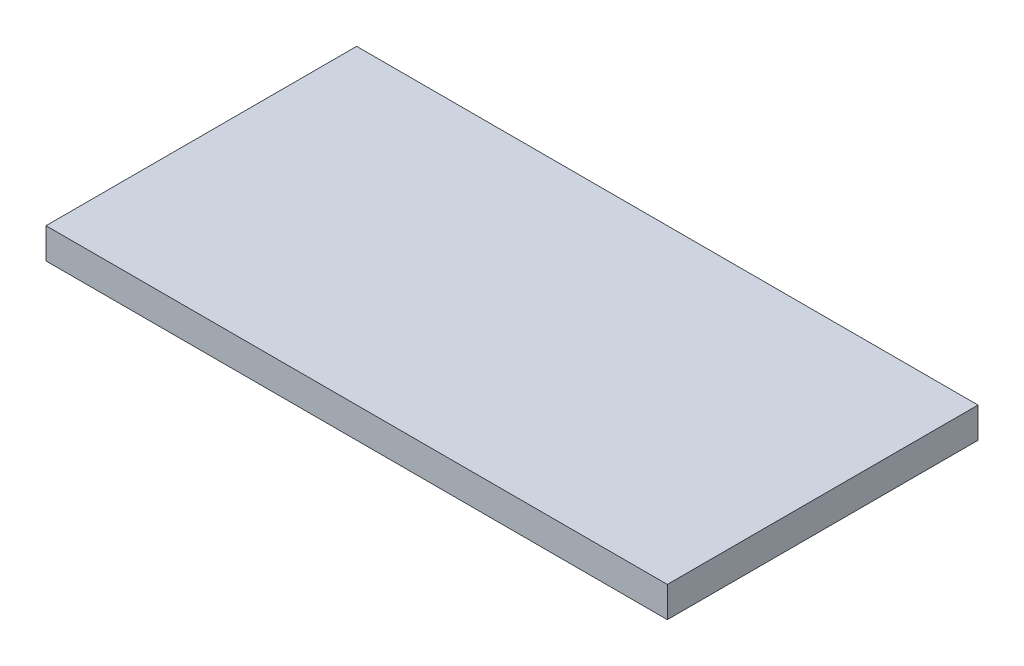
ISO-10303-21;
HEADER;
FILE_DESCRIPTION(('STEP AP214'),'2;1');
FILE_NAME('part.step','',(''),(''),'','','');
FILE_SCHEMA(('AUTOMOTIVE_DESIGN { 1 0 10303 214 1 1 1 1 }'));
ENDSEC;
DATA;
#1=APPLICATION_CONTEXT('core data for automotive mechanical design processes');
#2=APPLICATION_PROTOCOL_DEFINITION('international standard','automotive_design',2000,#1);
#3=PRODUCT_CONTEXT('',#1,'mechanical');
#4=PRODUCT('Part','Part','',(#3));
#5=PRODUCT_RELATED_PRODUCT_CATEGORY('part','',(#4));
#6=PRODUCT_DEFINITION_FORMATION('','',#4);
#7=PRODUCT_DEFINITION_CONTEXT('part definition',#1,'design');
#8=PRODUCT_DEFINITION('design','',#6,#7);
#9=PRODUCT_DEFINITION_SHAPE('','',#8);
#10=(LENGTH_UNIT() NAMED_UNIT(*) SI_UNIT(.MILLI.,.METRE.));
#11=(NAMED_UNIT(*) PLANE_ANGLE_UNIT() SI_UNIT($,.RADIAN.));
#12=(NAMED_UNIT(*) SI_UNIT($,.STERADIAN.) SOLID_ANGLE_UNIT());
#13=UNCERTAINTY_MEASURE_WITH_UNIT(LENGTH_MEASURE(1.E-05),#10,'distance_accuracy_value','');
#14=(GEOMETRIC_REPRESENTATION_CONTEXT(3) GLOBAL_UNCERTAINTY_ASSIGNED_CONTEXT((#13)) GLOBAL_UNIT_ASSIGNED_CONTEXT((#10,
#11,#12)) REPRESENTATION_CONTEXT('',''));
#15=CARTESIAN_POINT('',(0.,0.,0.));
#16=DIRECTION('',(0.,0.,1.));
#17=DIRECTION('',(1.,0.,0.));
#18=AXIS2_PLACEMENT_3D('',#15,#16,#17);
#19=CARTESIAN_POINT('',(-609.6,59.944,-304.8));
#20=DIRECTION('',(1.,0.,0.));
#21=DIRECTION('',(0.,0.,-1.));
#22=AXIS2_PLACEMENT_3D('',#19,#20,#21);
#23=PLANE('',#22);
#24=DIRECTION('',(0.,0.,1.));
#25=VECTOR('',#24,1.);
#26=CARTESIAN_POINT('',(-609.6,0.,-304.8));
#27=LINE('',#26,#25);
#28=CARTESIAN_POINT('',(-609.6,0.,-304.8));
#29=VERTEX_POINT('',#28);
#30=CARTESIAN_POINT('',(-609.6,0.,304.8));
#31=VERTEX_POINT('',#30);
#32=EDGE_CURVE('E94',#29,#31,#27,.T.);
#33=ORIENTED_EDGE('',*,*,#32,.T.);
#34=DIRECTION('',(0.,-1.,0.));
#35=VECTOR('',#34,1.);
#36=CARTESIAN_POINT('',(-609.6,59.944,304.8));
#37=LINE('',#36,#35);
#38=CARTESIAN_POINT('',(-609.6,59.944,304.8));
#39=VERTEX_POINT('',#38);
#40=EDGE_CURVE('E11',#39,#31,#37,.T.);
#41=ORIENTED_EDGE('',*,*,#40,.F.);
#42=DIRECTION('',(0.,0.,1.));
#43=VECTOR('',#42,1.);
#44=CARTESIAN_POINT('',(-609.6,59.944,-304.8));
#45=LINE('',#44,#43);
#46=CARTESIAN_POINT('',(-609.6,59.944,-304.8));
#47=VERTEX_POINT('',#46);
#48=EDGE_CURVE('E82',#47,#39,#45,.T.);
#49=ORIENTED_EDGE('',*,*,#48,.F.);
#50=DIRECTION('',(0.,-1.,0.));
#51=VECTOR('',#50,1.);
#52=CARTESIAN_POINT('',(-609.6,59.944,-304.8));
#53=LINE('',#52,#51);
#54=EDGE_CURVE('E90',#47,#29,#53,.T.);
#55=ORIENTED_EDGE('',*,*,#54,.T.);
#56=EDGE_LOOP('',(#33,#41,#49,#55));
#57=FACE_BOUND('',#56,.T.);
#58=ADVANCED_FACE('F31',(#57),#23,.F.);
#59=CARTESIAN_POINT('',(-609.6,59.944,304.8));
#60=DIRECTION('',(0.,0.,-1.));
#61=DIRECTION('',(-1.,0.,0.));
#62=AXIS2_PLACEMENT_3D('',#59,#60,#61);
#63=PLANE('',#62);
#64=DIRECTION('',(1.,0.,0.));
#65=VECTOR('',#64,1.);
#66=CARTESIAN_POINT('',(-609.6,0.,304.8));
#67=LINE('',#66,#65);
#68=CARTESIAN_POINT('',(609.6,0.,304.8));
#69=VERTEX_POINT('',#68);
#70=EDGE_CURVE('E86',#31,#69,#67,.T.);
#71=ORIENTED_EDGE('',*,*,#70,.T.);
#72=DIRECTION('',(0.,-1.,0.));
#73=VECTOR('',#72,1.);
#74=CARTESIAN_POINT('',(609.6,59.944,304.8));
#75=LINE('',#74,#73);
#76=CARTESIAN_POINT('',(609.6,59.944,304.8));
#77=VERTEX_POINT('',#76);
#78=EDGE_CURVE('E39',#77,#69,#75,.T.);
#79=ORIENTED_EDGE('',*,*,#78,.F.);
#80=DIRECTION('',(1.,0.,0.));
#81=VECTOR('',#80,1.);
#82=CARTESIAN_POINT('',(-609.6,59.944,304.8));
#83=LINE('',#82,#81);
#84=EDGE_CURVE('E77',#39,#77,#83,.T.);
#85=ORIENTED_EDGE('',*,*,#84,.F.);
#86=ORIENTED_EDGE('',*,*,#40,.T.);
#87=EDGE_LOOP('',(#71,#79,#85,#86));
#88=FACE_BOUND('',#87,.T.);
#89=ADVANCED_FACE('F85',(#88),#63,.F.);
#90=CARTESIAN_POINT('',(609.6,59.944,-304.8));
#91=DIRECTION('',(-1.,0.,0.));
#92=DIRECTION('',(0.,0.,1.));
#93=AXIS2_PLACEMENT_3D('',#90,#91,#92);
#94=PLANE('',#93);
#95=DIRECTION('',(0.,0.,-1.));
#96=VECTOR('',#95,1.);
#97=CARTESIAN_POINT('',(609.6,0.,-304.8));
#98=LINE('',#97,#96);
#99=CARTESIAN_POINT('',(609.6,0.,-304.8));
#100=VERTEX_POINT('',#99);
#101=EDGE_CURVE('E64',#69,#100,#98,.T.);
#102=ORIENTED_EDGE('',*,*,#101,.T.);
#103=DIRECTION('',(0.,-1.,0.));
#104=VECTOR('',#103,1.);
#105=CARTESIAN_POINT('',(609.6,59.944,-304.8));
#106=LINE('',#105,#104);
#107=CARTESIAN_POINT('',(609.6,59.944,-304.8));
#108=VERTEX_POINT('',#107);
#109=EDGE_CURVE('E87',#108,#100,#106,.T.);
#110=ORIENTED_EDGE('',*,*,#109,.F.);
#111=DIRECTION('',(0.,0.,-1.));
#112=VECTOR('',#111,1.);
#113=CARTESIAN_POINT('',(609.6,59.944,-304.8));
#114=LINE('',#113,#112);
#115=EDGE_CURVE('E80',#77,#108,#114,.T.);
#116=ORIENTED_EDGE('',*,*,#115,.F.);
#117=ORIENTED_EDGE('',*,*,#78,.T.);
#118=EDGE_LOOP('',(#102,#110,#116,#117));
#119=FACE_BOUND('',#118,.T.);
#120=ADVANCED_FACE('F88',(#119),#94,.F.);
#121=CARTESIAN_POINT('',(-609.6,59.944,-304.8));
#122=DIRECTION('',(0.,0.,1.));
#123=DIRECTION('',(1.,0.,0.));
#124=AXIS2_PLACEMENT_3D('',#121,#122,#123);
#125=PLANE('',#124);
#126=DIRECTION('',(-1.,0.,0.));
#127=VECTOR('',#126,1.);
#128=CARTESIAN_POINT('',(-609.6,0.,-304.8));
#129=LINE('',#128,#127);
#130=EDGE_CURVE('E70',#100,#29,#129,.T.);
#131=ORIENTED_EDGE('',*,*,#130,.T.);
#132=ORIENTED_EDGE('',*,*,#54,.F.);
#133=DIRECTION('',(-1.,0.,0.));
#134=VECTOR('',#133,1.);
#135=CARTESIAN_POINT('',(-609.6,59.944,-304.8));
#136=LINE('',#135,#134);
#137=EDGE_CURVE('E47',#108,#47,#136,.T.);
#138=ORIENTED_EDGE('',*,*,#137,.F.);
#139=ORIENTED_EDGE('',*,*,#109,.T.);
#140=EDGE_LOOP('',(#131,#132,#138,#139));
#141=FACE_BOUND('',#140,.T.);
#142=ADVANCED_FACE('F101',(#141),#125,.F.);
#143=CARTESIAN_POINT('',(-609.6,59.944,304.8));
#144=DIRECTION('',(0.,1.,0.));
#145=DIRECTION('',(0.,0.,1.));
#146=AXIS2_PLACEMENT_3D('',#143,#144,#145);
#147=PLANE('',#146);
#148=ORIENTED_EDGE('',*,*,#48,.T.);
#149=ORIENTED_EDGE('',*,*,#84,.T.);
#150=ORIENTED_EDGE('',*,*,#115,.T.);
#151=ORIENTED_EDGE('',*,*,#137,.T.);
#152=EDGE_LOOP('',(#148,#149,#150,#151));
#153=FACE_BOUND('',#152,.T.);
#154=ADVANCED_FACE('F78',(#153),#147,.T.);
#155=CARTESIAN_POINT('',(-609.6,0.,304.8));
#156=DIRECTION('',(0.,1.,0.));
#157=DIRECTION('',(0.,0.,1.));
#158=AXIS2_PLACEMENT_3D('',#155,#156,#157);
#159=PLANE('',#158);
#160=ORIENTED_EDGE('',*,*,#32,.F.);
#161=ORIENTED_EDGE('',*,*,#130,.F.);
#162=ORIENTED_EDGE('',*,*,#101,.F.);
#163=ORIENTED_EDGE('',*,*,#70,.F.);
#164=EDGE_LOOP('',(#160,#161,#162,#163));
#165=FACE_BOUND('',#164,.T.);
#166=ADVANCED_FACE('F104',(#165),#159,.F.);
#167=CLOSED_SHELL('',(#58,#89,#120,#142,#154,#166));
#168=MANIFOLD_SOLID_BREP('B2',#167);
#169=ADVANCED_BREP_SHAPE_REPRESENTATION('',(#18,#168),#14);
#170=SHAPE_DEFINITION_REPRESENTATION(#9,#169);
ENDSEC;
END-ISO-10303-21;
